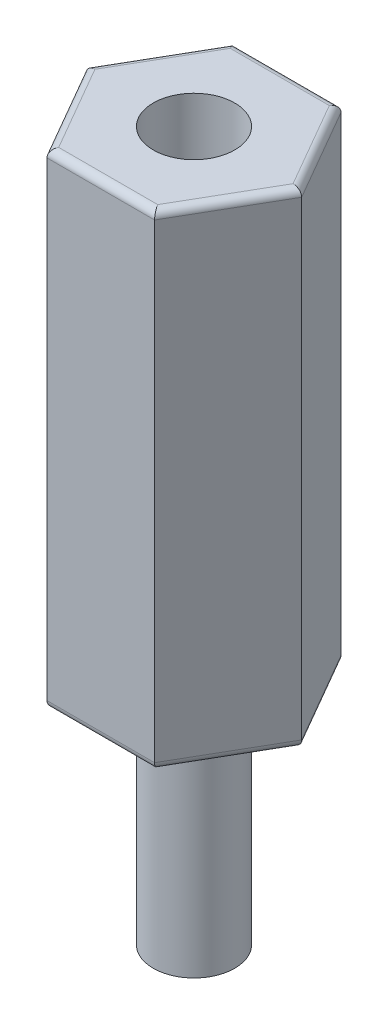
ISO-10303-21;
HEADER;
FILE_DESCRIPTION(('STEP AP214'),'2;1');
FILE_NAME('part.step','',(''),(''),'','','');
FILE_SCHEMA(('AUTOMOTIVE_DESIGN { 1 0 10303 214 1 1 1 1 }'));
ENDSEC;
DATA;
#1=APPLICATION_CONTEXT('core data for automotive mechanical design processes');
#2=APPLICATION_PROTOCOL_DEFINITION('international standard','automotive_design',2000,#1);
#3=PRODUCT_CONTEXT('',#1,'mechanical');
#4=PRODUCT('Part','Part','',(#3));
#5=PRODUCT_RELATED_PRODUCT_CATEGORY('part','',(#4));
#6=PRODUCT_DEFINITION_FORMATION('','',#4);
#7=PRODUCT_DEFINITION_CONTEXT('part definition',#1,'design');
#8=PRODUCT_DEFINITION('design','',#6,#7);
#9=PRODUCT_DEFINITION_SHAPE('','',#8);
#10=(LENGTH_UNIT() NAMED_UNIT(*) SI_UNIT(.MILLI.,.METRE.));
#11=(NAMED_UNIT(*) PLANE_ANGLE_UNIT() SI_UNIT($,.RADIAN.));
#12=(NAMED_UNIT(*) SI_UNIT($,.STERADIAN.) SOLID_ANGLE_UNIT());
#13=UNCERTAINTY_MEASURE_WITH_UNIT(LENGTH_MEASURE(1.E-05),#10,'distance_accuracy_value','');
#14=(GEOMETRIC_REPRESENTATION_CONTEXT(3) GLOBAL_UNCERTAINTY_ASSIGNED_CONTEXT((#13)) GLOBAL_UNIT_ASSIGNED_CONTEXT((#10,
#11,#12)) REPRESENTATION_CONTEXT('',''));
#15=CARTESIAN_POINT('',(0.,0.,0.));
#16=DIRECTION('',(0.,0.,1.));
#17=DIRECTION('',(1.,0.,0.));
#18=AXIS2_PLACEMENT_3D('',#15,#16,#17);
#19=CARTESIAN_POINT('',(2.88675134594813,0.,0.));
#20=DIRECTION('',(0.,1.,0.));
#21=DIRECTION('',(0.,0.,1.));
#22=AXIS2_PLACEMENT_3D('',#19,#20,#21);
#23=PLANE('',#22);
#24=DIRECTION('',(0.5,0.,-0.866025403784439));
#25=VECTOR('',#24,1.);
#26=CARTESIAN_POINT('',(2.71354626519124,0.,-0.100000000000001));
#27=LINE('',#26,#25);
#28=CARTESIAN_POINT('',(2.65581123827228,0.,0.));
#29=VERTEX_POINT('',#28);
#30=CARTESIAN_POINT('',(1.32790561913614,0.,2.3));
#31=VERTEX_POINT('',#30);
#32=EDGE_CURVE('E190',#29,#31,#27,.F.);
#33=ORIENTED_EDGE('',*,*,#32,.T.);
#34=DIRECTION('',(1.,0.,0.));
#35=VECTOR('',#34,1.);
#36=CARTESIAN_POINT('',(2.88675134594813,0.,2.3));
#37=LINE('',#36,#35);
#38=CARTESIAN_POINT('',(-1.32790561913614,0.,2.3));
#39=VERTEX_POINT('',#38);
#40=EDGE_CURVE('E43',#31,#39,#37,.F.);
#41=ORIENTED_EDGE('',*,*,#40,.T.);
#42=DIRECTION('',(0.5,0.,0.866025403784439));
#43=VECTOR('',#42,1.);
#44=CARTESIAN_POINT('',(-1.27017059221718,0.,2.4));
#45=LINE('',#44,#43);
#46=CARTESIAN_POINT('',(-2.65581123827228,0.,0.));
#47=VERTEX_POINT('',#46);
#48=EDGE_CURVE('E57',#39,#47,#45,.F.);
#49=ORIENTED_EDGE('',*,*,#48,.T.);
#50=DIRECTION('',(-0.5,0.,0.866025403784439));
#51=VECTOR('',#50,1.);
#52=CARTESIAN_POINT('',(-1.27017059221718,0.,-2.4));
#53=LINE('',#52,#51);
#54=CARTESIAN_POINT('',(-1.32790561913614,0.,-2.3));
#55=VERTEX_POINT('',#54);
#56=EDGE_CURVE('E196',#47,#55,#53,.F.);
#57=ORIENTED_EDGE('',*,*,#56,.T.);
#58=DIRECTION('',(-1.,0.,0.));
#59=VECTOR('',#58,1.);
#60=CARTESIAN_POINT('',(2.88675134594813,0.,-2.3));
#61=LINE('',#60,#59);
#62=CARTESIAN_POINT('',(1.32790561913614,0.,-2.3));
#63=VERTEX_POINT('',#62);
#64=EDGE_CURVE('E194',#55,#63,#61,.F.);
#65=ORIENTED_EDGE('',*,*,#64,.T.);
#66=DIRECTION('',(-0.5,0.,-0.866025403784439));
#67=VECTOR('',#66,1.);
#68=CARTESIAN_POINT('',(2.71354626519124,0.,0.0999999999999995));
#69=LINE('',#68,#67);
#70=EDGE_CURVE('E192',#63,#29,#69,.F.);
#71=ORIENTED_EDGE('',*,*,#70,.T.);
#72=EDGE_LOOP('',(#33,#41,#49,#57,#65,#71));
#73=FACE_BOUND('',#72,.T.);
#74=CARTESIAN_POINT('',(0.,0.,0.));
#75=DIRECTION('',(0.,1.,0.));
#76=DIRECTION('',(0.,0.,1.));
#77=AXIS2_PLACEMENT_3D('',#74,#75,#76);
#78=CIRCLE('',#77,1.0922);
#79=CARTESIAN_POINT('',(0.,0.,1.0922));
#80=VERTEX_POINT('',#79);
#81=EDGE_CURVE('E11',#80,#80,#78,.F.);
#82=ORIENTED_EDGE('',*,*,#81,.F.);
#83=EDGE_LOOP('',(#82));
#84=FACE_BOUND('',#83,.T.);
#85=ADVANCED_FACE('F35',(#73,#84),#23,.F.);
#86=CARTESIAN_POINT('',(1.44337567297406,13.,2.5));
#87=DIRECTION('',(-0.866025403784439,0.,-0.5));
#88=DIRECTION('',(-0.5,0.,0.866025403784439));
#89=AXIS2_PLACEMENT_3D('',#86,#87,#88);
#90=PLANE('',#89);
#91=DIRECTION('',(0.,-1.,0.));
#92=VECTOR('',#91,1.);
#93=CARTESIAN_POINT('',(2.88675134594813,13.,0.));
#94=LINE('',#93,#92);
#95=CARTESIAN_POINT('',(2.88675134594813,12.8,0.));
#96=VERTEX_POINT('',#95);
#97=CARTESIAN_POINT('',(2.88675134594813,0.200000000000002,0.));
#98=VERTEX_POINT('',#97);
#99=EDGE_CURVE('E151',#96,#98,#94,.T.);
#100=ORIENTED_EDGE('',*,*,#99,.F.);
#101=DIRECTION('',(0.5,0.,-0.866025403784439));
#102=VECTOR('',#101,1.);
#103=CARTESIAN_POINT('',(1.44337567297406,12.8,2.5));
#104=LINE('',#103,#102);
#105=CARTESIAN_POINT('',(1.44337567297406,12.8,2.5));
#106=VERTEX_POINT('',#105);
#107=EDGE_CURVE('E142',#96,#106,#104,.F.);
#108=ORIENTED_EDGE('',*,*,#107,.T.);
#109=DIRECTION('',(0.,-1.,0.));
#110=VECTOR('',#109,1.);
#111=CARTESIAN_POINT('',(1.44337567297406,13.,2.5));
#112=LINE('',#111,#110);
#113=CARTESIAN_POINT('',(1.44337567297406,0.200000000000004,2.5));
#114=VERTEX_POINT('',#113);
#115=EDGE_CURVE('E210',#106,#114,#112,.T.);
#116=ORIENTED_EDGE('',*,*,#115,.T.);
#117=DIRECTION('',(0.5,0.,-0.866025403784439));
#118=VECTOR('',#117,1.);
#119=CARTESIAN_POINT('',(1.44337567297406,0.200000000000001,2.5));
#120=LINE('',#119,#118);
#121=EDGE_CURVE('E183',#114,#98,#120,.T.);
#122=ORIENTED_EDGE('',*,*,#121,.T.);
#123=EDGE_LOOP('',(#100,#108,#116,#122));
#124=FACE_BOUND('',#123,.T.);
#125=ADVANCED_FACE('F255',(#124),#90,.F.);
#126=CARTESIAN_POINT('',(2.88675134594813,13.,0.));
#127=DIRECTION('',(-0.866025403784438,0.,0.5));
#128=DIRECTION('',(0.5,0.,0.866025403784439));
#129=AXIS2_PLACEMENT_3D('',#126,#127,#128);
#130=PLANE('',#129);
#131=DIRECTION('',(0.,-1.,0.));
#132=VECTOR('',#131,1.);
#133=CARTESIAN_POINT('',(1.44337567297406,13.,-2.5));
#134=LINE('',#133,#132);
#135=CARTESIAN_POINT('',(1.44337567297406,12.8,-2.5));
#136=VERTEX_POINT('',#135);
#137=CARTESIAN_POINT('',(1.44337567297406,0.200000000000002,-2.5));
#138=VERTEX_POINT('',#137);
#139=EDGE_CURVE('E154',#136,#138,#134,.T.);
#140=ORIENTED_EDGE('',*,*,#139,.F.);
#141=DIRECTION('',(-0.5,0.,-0.866025403784439));
#142=VECTOR('',#141,1.);
#143=CARTESIAN_POINT('',(2.88675134594813,12.8,0.));
#144=LINE('',#143,#142);
#145=EDGE_CURVE('E188',#136,#96,#144,.F.);
#146=ORIENTED_EDGE('',*,*,#145,.T.);
#147=ORIENTED_EDGE('',*,*,#99,.T.);
#148=DIRECTION('',(-0.5,0.,-0.866025403784439));
#149=VECTOR('',#148,1.);
#150=CARTESIAN_POINT('',(2.88675134594813,0.200000000000001,0.));
#151=LINE('',#150,#149);
#152=EDGE_CURVE('E186',#98,#138,#151,.T.);
#153=ORIENTED_EDGE('',*,*,#152,.T.);
#154=EDGE_LOOP('',(#140,#146,#147,#153));
#155=FACE_BOUND('',#154,.T.);
#156=ADVANCED_FACE('F273',(#155),#130,.F.);
#157=CARTESIAN_POINT('',(1.44337567297406,13.,-2.5));
#158=DIRECTION('',(0.,0.,1.));
#159=DIRECTION('',(1.,0.,0.));
#160=AXIS2_PLACEMENT_3D('',#157,#158,#159);
#161=PLANE('',#160);
#162=DIRECTION('',(0.,-1.,0.));
#163=VECTOR('',#162,1.);
#164=CARTESIAN_POINT('',(-1.44337567297406,13.,-2.5));
#165=LINE('',#164,#163);
#166=CARTESIAN_POINT('',(-1.44337567297406,12.8,-2.5));
#167=VERTEX_POINT('',#166);
#168=CARTESIAN_POINT('',(-1.44337567297406,0.200000000000002,-2.5));
#169=VERTEX_POINT('',#168);
#170=EDGE_CURVE('E264',#167,#169,#165,.T.);
#171=ORIENTED_EDGE('',*,*,#170,.F.);
#172=DIRECTION('',(-1.,0.,0.));
#173=VECTOR('',#172,1.);
#174=CARTESIAN_POINT('',(1.44337567297406,12.8,-2.5));
#175=LINE('',#174,#173);
#176=EDGE_CURVE('E167',#167,#136,#175,.F.);
#177=ORIENTED_EDGE('',*,*,#176,.T.);
#178=ORIENTED_EDGE('',*,*,#139,.T.);
#179=DIRECTION('',(-1.,0.,0.));
#180=VECTOR('',#179,1.);
#181=CARTESIAN_POINT('',(1.44337567297406,0.200000000000001,-2.5));
#182=LINE('',#181,#180);
#183=EDGE_CURVE('E165',#138,#169,#182,.T.);
#184=ORIENTED_EDGE('',*,*,#183,.T.);
#185=EDGE_LOOP('',(#171,#177,#178,#184));
#186=FACE_BOUND('',#185,.T.);
#187=ADVANCED_FACE('F270',(#186),#161,.F.);
#188=CARTESIAN_POINT('',(-1.44337567297406,13.,-2.5));
#189=DIRECTION('',(0.866025403784439,0.,0.5));
#190=DIRECTION('',(0.5,0.,-0.866025403784439));
#191=AXIS2_PLACEMENT_3D('',#188,#189,#190);
#192=PLANE('',#191);
#193=DIRECTION('',(0.,-1.,0.));
#194=VECTOR('',#193,1.);
#195=CARTESIAN_POINT('',(-2.88675134594813,13.,0.));
#196=LINE('',#195,#194);
#197=CARTESIAN_POINT('',(-2.88675134594813,12.8,0.));
#198=VERTEX_POINT('',#197);
#199=CARTESIAN_POINT('',(-2.88675134594813,0.200000000000002,0.));
#200=VERTEX_POINT('',#199);
#201=EDGE_CURVE('E257',#198,#200,#196,.T.);
#202=ORIENTED_EDGE('',*,*,#201,.F.);
#203=DIRECTION('',(-0.5,0.,0.866025403784439));
#204=VECTOR('',#203,1.);
#205=CARTESIAN_POINT('',(-1.44337567297406,12.8,-2.5));
#206=LINE('',#205,#204);
#207=EDGE_CURVE('E172',#198,#167,#206,.F.);
#208=ORIENTED_EDGE('',*,*,#207,.T.);
#209=ORIENTED_EDGE('',*,*,#170,.T.);
#210=DIRECTION('',(-0.5,0.,0.866025403784439));
#211=VECTOR('',#210,1.);
#212=CARTESIAN_POINT('',(-1.44337567297406,0.200000000000001,-2.5));
#213=LINE('',#212,#211);
#214=EDGE_CURVE('E170',#169,#200,#213,.T.);
#215=ORIENTED_EDGE('',*,*,#214,.T.);
#216=EDGE_LOOP('',(#202,#208,#209,#215));
#217=FACE_BOUND('',#216,.T.);
#218=ADVANCED_FACE('F280',(#217),#192,.F.);
#219=CARTESIAN_POINT('',(-2.88675134594813,13.,0.));
#220=DIRECTION('',(0.866025403784439,0.,-0.5));
#221=DIRECTION('',(-0.5,0.,-0.866025403784439));
#222=AXIS2_PLACEMENT_3D('',#219,#220,#221);
#223=PLANE('',#222);
#224=DIRECTION('',(0.,-1.,0.));
#225=VECTOR('',#224,1.);
#226=CARTESIAN_POINT('',(-1.44337567297406,13.,2.5));
#227=LINE('',#226,#225);
#228=CARTESIAN_POINT('',(-1.44337567297406,12.8,2.5));
#229=VERTEX_POINT('',#228);
#230=CARTESIAN_POINT('',(-1.44337567297406,0.200000000000002,2.5));
#231=VERTEX_POINT('',#230);
#232=EDGE_CURVE('E252',#229,#231,#227,.T.);
#233=ORIENTED_EDGE('',*,*,#232,.F.);
#234=DIRECTION('',(0.5,0.,0.866025403784439));
#235=VECTOR('',#234,1.);
#236=CARTESIAN_POINT('',(-2.88675134594813,12.8,0.));
#237=LINE('',#236,#235);
#238=EDGE_CURVE('E176',#229,#198,#237,.F.);
#239=ORIENTED_EDGE('',*,*,#238,.T.);
#240=ORIENTED_EDGE('',*,*,#201,.T.);
#241=DIRECTION('',(0.5,0.,0.866025403784439));
#242=VECTOR('',#241,1.);
#243=CARTESIAN_POINT('',(-2.88675134594813,0.200000000000001,0.));
#244=LINE('',#243,#242);
#245=EDGE_CURVE('E174',#200,#231,#244,.T.);
#246=ORIENTED_EDGE('',*,*,#245,.T.);
#247=EDGE_LOOP('',(#233,#239,#240,#246));
#248=FACE_BOUND('',#247,.T.);
#249=ADVANCED_FACE('F292',(#248),#223,.F.);
#250=CARTESIAN_POINT('',(-1.44337567297406,13.,2.5));
#251=DIRECTION('',(0.,0.,-1.));
#252=DIRECTION('',(-1.,0.,0.));
#253=AXIS2_PLACEMENT_3D('',#250,#251,#252);
#254=PLANE('',#253);
#255=ORIENTED_EDGE('',*,*,#115,.F.);
#256=DIRECTION('',(1.,0.,0.));
#257=VECTOR('',#256,1.);
#258=CARTESIAN_POINT('',(-1.44337567297406,12.8,2.5));
#259=LINE('',#258,#257);
#260=EDGE_CURVE('E181',#106,#229,#259,.F.);
#261=ORIENTED_EDGE('',*,*,#260,.T.);
#262=ORIENTED_EDGE('',*,*,#232,.T.);
#263=DIRECTION('',(1.,0.,0.));
#264=VECTOR('',#263,1.);
#265=CARTESIAN_POINT('',(-1.44337567297406,0.200000000000001,2.5));
#266=LINE('',#265,#264);
#267=EDGE_CURVE('E178',#231,#114,#266,.T.);
#268=ORIENTED_EDGE('',*,*,#267,.T.);
#269=EDGE_LOOP('',(#255,#261,#262,#268));
#270=FACE_BOUND('',#269,.T.);
#271=ADVANCED_FACE('F249',(#270),#254,.F.);
#272=CARTESIAN_POINT('',(2.88675134594813,13.,0.));
#273=DIRECTION('',(0.,1.,0.));
#274=DIRECTION('',(0.,0.,1.));
#275=AXIS2_PLACEMENT_3D('',#272,#273,#274);
#276=PLANE('',#275);
#277=CARTESIAN_POINT('',(0.,13.,0.));
#278=DIRECTION('',(0.,1.,0.));
#279=DIRECTION('',(0.,0.,1.));
#280=AXIS2_PLACEMENT_3D('',#277,#278,#279);
#281=CIRCLE('',#280,1.0922);
#282=CARTESIAN_POINT('',(0.,13.,1.0922));
#283=VERTEX_POINT('',#282);
#284=EDGE_CURVE('E375',#283,#283,#281,.T.);
#285=ORIENTED_EDGE('',*,*,#284,.F.);
#286=EDGE_LOOP('',(#285));
#287=FACE_BOUND('',#286,.T.);
#288=DIRECTION('',(-0.5,0.,-0.866025403784439));
#289=VECTOR('',#288,1.);
#290=CARTESIAN_POINT('',(1.27017059221718,13.,-2.4));
#291=LINE('',#290,#289);
#292=CARTESIAN_POINT('',(2.65581123827228,13.,0.));
#293=VERTEX_POINT('',#292);
#294=CARTESIAN_POINT('',(1.32790561913614,13.,-2.3));
#295=VERTEX_POINT('',#294);
#296=EDGE_CURVE('E130',#293,#295,#291,.T.);
#297=ORIENTED_EDGE('',*,*,#296,.T.);
#298=DIRECTION('',(-1.,0.,0.));
#299=VECTOR('',#298,1.);
#300=CARTESIAN_POINT('',(-1.44337567297406,13.,-2.3));
#301=LINE('',#300,#299);
#302=CARTESIAN_POINT('',(-1.32790561913614,13.,-2.3));
#303=VERTEX_POINT('',#302);
#304=EDGE_CURVE('E163',#295,#303,#301,.T.);
#305=ORIENTED_EDGE('',*,*,#304,.T.);
#306=DIRECTION('',(-0.5,0.,0.866025403784439));
#307=VECTOR('',#306,1.);
#308=CARTESIAN_POINT('',(-2.71354626519124,13.,0.100000000000001));
#309=LINE('',#308,#307);
#310=CARTESIAN_POINT('',(-2.65581123827228,13.,0.));
#311=VERTEX_POINT('',#310);
#312=EDGE_CURVE('E161',#303,#311,#309,.T.);
#313=ORIENTED_EDGE('',*,*,#312,.T.);
#314=DIRECTION('',(0.5,0.,0.866025403784439));
#315=VECTOR('',#314,1.);
#316=CARTESIAN_POINT('',(-1.27017059221718,13.,2.4));
#317=LINE('',#316,#315);
#318=CARTESIAN_POINT('',(-1.32790561913614,13.,2.3));
#319=VERTEX_POINT('',#318);
#320=EDGE_CURVE('E159',#311,#319,#317,.T.);
#321=ORIENTED_EDGE('',*,*,#320,.T.);
#322=DIRECTION('',(1.,0.,0.));
#323=VECTOR('',#322,1.);
#324=CARTESIAN_POINT('',(1.44337567297406,13.,2.3));
#325=LINE('',#324,#323);
#326=CARTESIAN_POINT('',(1.32790561913614,13.,2.3));
#327=VERTEX_POINT('',#326);
#328=EDGE_CURVE('E133',#319,#327,#325,.T.);
#329=ORIENTED_EDGE('',*,*,#328,.T.);
#330=DIRECTION('',(0.5,0.,-0.866025403784439));
#331=VECTOR('',#330,1.);
#332=CARTESIAN_POINT('',(2.71354626519124,13.,-0.100000000000001));
#333=LINE('',#332,#331);
#334=EDGE_CURVE('E125',#327,#293,#333,.T.);
#335=ORIENTED_EDGE('',*,*,#334,.T.);
#336=EDGE_LOOP('',(#297,#305,#313,#321,#329,#335));
#337=FACE_BOUND('',#336,.T.);
#338=ADVANCED_FACE('F127',(#287,#337),#276,.T.);
#339=CARTESIAN_POINT('',(2.88675134594813,12.8,2.3));
#340=DIRECTION('',(-1.,0.,0.));
#341=DIRECTION('',(0.,0.,1.));
#342=AXIS2_PLACEMENT_3D('',#339,#340,#341);
#343=CYLINDRICAL_SURFACE('',#342,0.2);
#344=CARTESIAN_POINT('',(-1.32790561913614,12.8,2.3));
#345=DIRECTION('',(-0.866025403784439,0.,-0.5));
#346=DIRECTION('',(-0.5,0.,0.866025403784439));
#347=AXIS2_PLACEMENT_3D('',#344,#345,#346);
#348=ELLIPSE('',#347,0.23094010767585,0.2);
#349=EDGE_CURVE('E145',#229,#319,#348,.T.);
#350=ORIENTED_EDGE('',*,*,#349,.F.);
#351=ORIENTED_EDGE('',*,*,#260,.F.);
#352=CARTESIAN_POINT('',(1.32790561913614,12.8,2.3));
#353=DIRECTION('',(-0.866025403784438,0.,0.5));
#354=DIRECTION('',(0.5,0.,0.866025403784439));
#355=AXIS2_PLACEMENT_3D('',#352,#353,#354);
#356=ELLIPSE('',#355,0.23094010767585,0.2);
#357=EDGE_CURVE('E208',#327,#106,#356,.F.);
#358=ORIENTED_EDGE('',*,*,#357,.F.);
#359=ORIENTED_EDGE('',*,*,#328,.F.);
#360=EDGE_LOOP('',(#350,#351,#358,#359));
#361=FACE_BOUND('',#360,.T.);
#362=ADVANCED_FACE('F315',(#361),#343,.T.);
#363=CARTESIAN_POINT('',(2.71354626519124,12.8,-0.100000000000001));
#364=DIRECTION('',(-0.5,0.,0.866025403784439));
#365=DIRECTION('',(0.866025403784439,0.,0.5));
#366=AXIS2_PLACEMENT_3D('',#363,#364,#365);
#367=CYLINDRICAL_SURFACE('',#366,0.2);
#368=ORIENTED_EDGE('',*,*,#357,.T.);
#369=ORIENTED_EDGE('',*,*,#107,.F.);
#370=CARTESIAN_POINT('',(2.65581123827228,12.8,0.));
#371=DIRECTION('',(0.,0.,1.));
#372=DIRECTION('',(1.,0.,0.));
#373=AXIS2_PLACEMENT_3D('',#370,#371,#372);
#374=ELLIPSE('',#373,0.23094010767585,0.2);
#375=EDGE_CURVE('E140',#293,#96,#374,.F.);
#376=ORIENTED_EDGE('',*,*,#375,.F.);
#377=ORIENTED_EDGE('',*,*,#334,.F.);
#378=EDGE_LOOP('',(#368,#369,#376,#377));
#379=FACE_BOUND('',#378,.T.);
#380=ADVANCED_FACE('F141',(#379),#367,.T.);
#381=CARTESIAN_POINT('',(-1.27017059221718,12.8,2.4));
#382=DIRECTION('',(-0.5,0.,-0.866025403784439));
#383=DIRECTION('',(-0.866025403784439,0.,0.5));
#384=AXIS2_PLACEMENT_3D('',#381,#382,#383);
#385=CYLINDRICAL_SURFACE('',#384,0.2);
#386=ORIENTED_EDGE('',*,*,#349,.T.);
#387=ORIENTED_EDGE('',*,*,#320,.F.);
#388=CARTESIAN_POINT('',(-2.65581123827228,12.8,0.));
#389=DIRECTION('',(0.,0.,-1.));
#390=DIRECTION('',(-1.,0.,0.));
#391=AXIS2_PLACEMENT_3D('',#388,#389,#390);
#392=ELLIPSE('',#391,0.23094010767585,0.2);
#393=EDGE_CURVE('E146',#198,#311,#392,.T.);
#394=ORIENTED_EDGE('',*,*,#393,.F.);
#395=ORIENTED_EDGE('',*,*,#238,.F.);
#396=EDGE_LOOP('',(#386,#387,#394,#395));
#397=FACE_BOUND('',#396,.T.);
#398=ADVANCED_FACE('F306',(#397),#385,.T.);
#399=CARTESIAN_POINT('',(2.71354626519124,12.8,0.0999999999999994));
#400=DIRECTION('',(0.5,0.,0.866025403784439));
#401=DIRECTION('',(0.866025403784438,0.,-0.5));
#402=AXIS2_PLACEMENT_3D('',#399,#400,#401);
#403=CYLINDRICAL_SURFACE('',#402,0.2);
#404=ORIENTED_EDGE('',*,*,#375,.T.);
#405=ORIENTED_EDGE('',*,*,#145,.F.);
#406=CARTESIAN_POINT('',(1.32790561913614,12.8,-2.3));
#407=DIRECTION('',(0.866025403784439,0.,0.5));
#408=DIRECTION('',(-0.5,0.,0.866025403784439));
#409=AXIS2_PLACEMENT_3D('',#406,#407,#408);
#410=ELLIPSE('',#409,0.23094010767585,0.2);
#411=EDGE_CURVE('E149',#295,#136,#410,.F.);
#412=ORIENTED_EDGE('',*,*,#411,.F.);
#413=ORIENTED_EDGE('',*,*,#296,.F.);
#414=EDGE_LOOP('',(#404,#405,#412,#413));
#415=FACE_BOUND('',#414,.T.);
#416=ADVANCED_FACE('F148',(#415),#403,.T.);
#417=CARTESIAN_POINT('',(-1.27017059221718,12.8,-2.4));
#418=DIRECTION('',(0.5,0.,-0.866025403784439));
#419=DIRECTION('',(-0.866025403784439,0.,-0.5));
#420=AXIS2_PLACEMENT_3D('',#417,#418,#419);
#421=CYLINDRICAL_SURFACE('',#420,0.2);
#422=ORIENTED_EDGE('',*,*,#393,.T.);
#423=ORIENTED_EDGE('',*,*,#312,.F.);
#424=CARTESIAN_POINT('',(-1.32790561913614,12.8,-2.3));
#425=DIRECTION('',(0.866025403784439,0.,-0.5));
#426=DIRECTION('',(-0.5,0.,-0.866025403784439));
#427=AXIS2_PLACEMENT_3D('',#424,#425,#426);
#428=ELLIPSE('',#427,0.23094010767585,0.2);
#429=EDGE_CURVE('E200',#167,#303,#428,.T.);
#430=ORIENTED_EDGE('',*,*,#429,.F.);
#431=ORIENTED_EDGE('',*,*,#207,.F.);
#432=EDGE_LOOP('',(#422,#423,#430,#431));
#433=FACE_BOUND('',#432,.T.);
#434=ADVANCED_FACE('F310',(#433),#421,.T.);
#435=CARTESIAN_POINT('',(2.88675134594813,12.8,-2.3));
#436=DIRECTION('',(1.,0.,0.));
#437=DIRECTION('',(0.,0.,-1.));
#438=AXIS2_PLACEMENT_3D('',#435,#436,#437);
#439=CYLINDRICAL_SURFACE('',#438,0.2);
#440=ORIENTED_EDGE('',*,*,#411,.T.);
#441=ORIENTED_EDGE('',*,*,#176,.F.);
#442=ORIENTED_EDGE('',*,*,#429,.T.);
#443=ORIENTED_EDGE('',*,*,#304,.F.);
#444=EDGE_LOOP('',(#440,#441,#442,#443));
#445=FACE_BOUND('',#444,.T.);
#446=ADVANCED_FACE('F312',(#445),#439,.T.);
#447=CARTESIAN_POINT('',(1.44337567297406,0.200000000000001,-2.3));
#448=DIRECTION('',(-1.,0.,0.));
#449=DIRECTION('',(0.,0.,1.));
#450=AXIS2_PLACEMENT_3D('',#447,#448,#449);
#451=CYLINDRICAL_SURFACE('',#450,0.2);
#452=CARTESIAN_POINT('',(1.32790561913614,0.200000000000001,-2.3));
#453=DIRECTION('',(-0.866025403784439,0.,-0.5));
#454=DIRECTION('',(0.5,0.,-0.866025403784439));
#455=AXIS2_PLACEMENT_3D('',#452,#453,#454);
#456=ELLIPSE('',#455,0.23094010767585,0.2);
#457=EDGE_CURVE('E221',#63,#138,#456,.F.);
#458=ORIENTED_EDGE('',*,*,#457,.F.);
#459=ORIENTED_EDGE('',*,*,#64,.F.);
#460=CARTESIAN_POINT('',(-1.32790561913614,0.200000000000001,-2.3));
#461=DIRECTION('',(-0.866025403784439,0.,0.5));
#462=DIRECTION('',(-0.5,0.,-0.866025403784439));
#463=AXIS2_PLACEMENT_3D('',#460,#461,#462);
#464=ELLIPSE('',#463,0.23094010767585,0.2);
#465=EDGE_CURVE('E202',#169,#55,#464,.T.);
#466=ORIENTED_EDGE('',*,*,#465,.F.);
#467=ORIENTED_EDGE('',*,*,#183,.F.);
#468=EDGE_LOOP('',(#458,#459,#466,#467));
#469=FACE_BOUND('',#468,.T.);
#470=ADVANCED_FACE('F37',(#469),#451,.T.);
#471=CARTESIAN_POINT('',(-1.27017059221718,0.200000000000001,-2.4));
#472=DIRECTION('',(-0.5,0.,0.866025403784439));
#473=DIRECTION('',(0.866025403784439,0.,0.5));
#474=AXIS2_PLACEMENT_3D('',#471,#472,#473);
#475=CYLINDRICAL_SURFACE('',#474,0.2);
#476=ORIENTED_EDGE('',*,*,#465,.T.);
#477=ORIENTED_EDGE('',*,*,#56,.F.);
#478=CARTESIAN_POINT('',(-2.65581123827228,0.200000000000001,0.));
#479=DIRECTION('',(0.,0.,1.));
#480=DIRECTION('',(-1.,0.,0.));
#481=AXIS2_PLACEMENT_3D('',#478,#479,#480);
#482=ELLIPSE('',#481,0.23094010767585,0.2);
#483=EDGE_CURVE('E218',#200,#47,#482,.T.);
#484=ORIENTED_EDGE('',*,*,#483,.F.);
#485=ORIENTED_EDGE('',*,*,#214,.F.);
#486=EDGE_LOOP('',(#476,#477,#484,#485));
#487=FACE_BOUND('',#486,.T.);
#488=ADVANCED_FACE('F227',(#487),#475,.T.);
#489=CARTESIAN_POINT('',(2.71354626519124,0.200000000000001,0.0999999999999992));
#490=DIRECTION('',(-0.5,0.,-0.866025403784439));
#491=DIRECTION('',(-0.866025403784438,0.,0.5));
#492=AXIS2_PLACEMENT_3D('',#489,#490,#491);
#493=CYLINDRICAL_SURFACE('',#492,0.2);
#494=ORIENTED_EDGE('',*,*,#457,.T.);
#495=ORIENTED_EDGE('',*,*,#152,.F.);
#496=CARTESIAN_POINT('',(2.65581123827228,0.200000000000001,0.));
#497=DIRECTION('',(0.,0.,-1.));
#498=DIRECTION('',(1.,0.,0.));
#499=AXIS2_PLACEMENT_3D('',#496,#497,#498);
#500=ELLIPSE('',#499,0.23094010767585,0.2);
#501=EDGE_CURVE('E215',#29,#98,#500,.F.);
#502=ORIENTED_EDGE('',*,*,#501,.F.);
#503=ORIENTED_EDGE('',*,*,#70,.F.);
#504=EDGE_LOOP('',(#494,#495,#502,#503));
#505=FACE_BOUND('',#504,.T.);
#506=ADVANCED_FACE('F239',(#505),#493,.T.);
#507=CARTESIAN_POINT('',(-2.71354626519124,0.200000000000001,-0.0999999999999996));
#508=DIRECTION('',(0.5,0.,0.866025403784439));
#509=DIRECTION('',(0.866025403784439,0.,-0.5));
#510=AXIS2_PLACEMENT_3D('',#507,#508,#509);
#511=CYLINDRICAL_SURFACE('',#510,0.2);
#512=ORIENTED_EDGE('',*,*,#483,.T.);
#513=ORIENTED_EDGE('',*,*,#48,.F.);
#514=CARTESIAN_POINT('',(-1.32790561913614,0.200000000000001,2.3));
#515=DIRECTION('',(0.866025403784439,0.,0.5));
#516=DIRECTION('',(-0.5,0.,0.866025403784439));
#517=AXIS2_PLACEMENT_3D('',#514,#515,#516);
#518=ELLIPSE('',#517,0.23094010767585,0.2);
#519=EDGE_CURVE('E50',#231,#39,#518,.T.);
#520=ORIENTED_EDGE('',*,*,#519,.F.);
#521=ORIENTED_EDGE('',*,*,#245,.F.);
#522=EDGE_LOOP('',(#512,#513,#520,#521));
#523=FACE_BOUND('',#522,.T.);
#524=ADVANCED_FACE('F318',(#523),#511,.T.);
#525=CARTESIAN_POINT('',(1.27017059221718,0.200000000000001,2.4));
#526=DIRECTION('',(0.5,0.,-0.866025403784439));
#527=DIRECTION('',(-0.866025403784439,0.,-0.5));
#528=AXIS2_PLACEMENT_3D('',#525,#526,#527);
#529=CYLINDRICAL_SURFACE('',#528,0.2);
#530=ORIENTED_EDGE('',*,*,#501,.T.);
#531=ORIENTED_EDGE('',*,*,#121,.F.);
#532=CARTESIAN_POINT('',(1.32790561913614,0.200000000000001,2.3));
#533=DIRECTION('',(0.866025403784438,0.,-0.5));
#534=DIRECTION('',(-0.5,0.,-0.866025403784439));
#535=AXIS2_PLACEMENT_3D('',#532,#533,#534);
#536=ELLIPSE('',#535,0.23094010767585,0.2);
#537=EDGE_CURVE('E211',#31,#114,#536,.F.);
#538=ORIENTED_EDGE('',*,*,#537,.F.);
#539=ORIENTED_EDGE('',*,*,#32,.F.);
#540=EDGE_LOOP('',(#530,#531,#538,#539));
#541=FACE_BOUND('',#540,.T.);
#542=ADVANCED_FACE('F243',(#541),#529,.T.);
#543=CARTESIAN_POINT('',(-1.44337567297406,0.200000000000001,2.3));
#544=DIRECTION('',(1.,0.,0.));
#545=DIRECTION('',(0.,0.,-1.));
#546=AXIS2_PLACEMENT_3D('',#543,#544,#545);
#547=CYLINDRICAL_SURFACE('',#546,0.2);
#548=ORIENTED_EDGE('',*,*,#519,.T.);
#549=ORIENTED_EDGE('',*,*,#40,.F.);
#550=ORIENTED_EDGE('',*,*,#537,.T.);
#551=ORIENTED_EDGE('',*,*,#267,.F.);
#552=EDGE_LOOP('',(#548,#549,#550,#551));
#553=FACE_BOUND('',#552,.T.);
#554=ADVANCED_FACE('F244',(#553),#547,.T.);
#555=CARTESIAN_POINT('',(0.,-6.,0.));
#556=DIRECTION('',(0.,1.,0.));
#557=DIRECTION('',(0.,0.,1.));
#558=AXIS2_PLACEMENT_3D('',#555,#556,#557);
#559=CYLINDRICAL_SURFACE('',#558,1.0922);
#560=CARTESIAN_POINT('',(0.,-6.,0.));
#561=DIRECTION('',(0.,-1.,0.));
#562=DIRECTION('',(0.,0.,-1.));
#563=AXIS2_PLACEMENT_3D('',#560,#561,#562);
#564=CIRCLE('',#563,1.0922);
#565=CARTESIAN_POINT('',(0.,-6.,-1.0922));
#566=VERTEX_POINT('',#565);
#567=EDGE_CURVE('E213',#566,#566,#564,.T.);
#568=ORIENTED_EDGE('',*,*,#567,.F.);
#569=EDGE_LOOP('',(#568));
#570=FACE_BOUND('',#569,.T.);
#571=ORIENTED_EDGE('',*,*,#81,.T.);
#572=EDGE_LOOP('',(#571));
#573=FACE_BOUND('',#572,.T.);
#574=ADVANCED_FACE('F349',(#570,#573),#559,.T.);
#575=CARTESIAN_POINT('',(0.,-6.,0.));
#576=DIRECTION('',(0.,-1.,0.));
#577=DIRECTION('',(0.,0.,-1.));
#578=AXIS2_PLACEMENT_3D('',#575,#576,#577);
#579=PLANE('',#578);
#580=ORIENTED_EDGE('',*,*,#567,.T.);
#581=EDGE_LOOP('',(#580));
#582=FACE_BOUND('',#581,.T.);
#583=ADVANCED_FACE('F353',(#582),#579,.T.);
#584=CARTESIAN_POINT('',(0.,8.24,0.));
#585=DIRECTION('',(0.,1.,0.));
#586=DIRECTION('',(0.,0.,1.));
#587=AXIS2_PLACEMENT_3D('',#584,#585,#586);
#588=CYLINDRICAL_SURFACE('',#587,1.0922);
#589=CARTESIAN_POINT('',(0.,8.24,0.));
#590=DIRECTION('',(0.,1.,0.));
#591=DIRECTION('',(0.,0.,1.));
#592=AXIS2_PLACEMENT_3D('',#589,#590,#591);
#593=CIRCLE('',#592,1.0922);
#594=CARTESIAN_POINT('',(0.,8.24,1.0922));
#595=VERTEX_POINT('',#594);
#596=EDGE_CURVE('E374',#595,#595,#593,.T.);
#597=ORIENTED_EDGE('',*,*,#596,.F.);
#598=EDGE_LOOP('',(#597));
#599=FACE_BOUND('',#598,.T.);
#600=ORIENTED_EDGE('',*,*,#284,.T.);
#601=EDGE_LOOP('',(#600));
#602=FACE_BOUND('',#601,.T.);
#603=ADVANCED_FACE('F358',(#599,#602),#588,.F.);
#604=CARTESIAN_POINT('',(0.,8.24,0.));
#605=DIRECTION('',(0.,1.,0.));
#606=DIRECTION('',(0.,0.,1.));
#607=AXIS2_PLACEMENT_3D('',#604,#605,#606);
#608=PLANE('',#607);
#609=ORIENTED_EDGE('',*,*,#596,.T.);
#610=EDGE_LOOP('',(#609));
#611=FACE_BOUND('',#610,.T.);
#612=ADVANCED_FACE('F366',(#611),#608,.T.);
#613=CLOSED_SHELL('',(#85,#125,#156,#187,#218,#249,#271,#338,#362,#380,#398,#416,#434,#446,#470,
#488,#506,#524,#542,#554,#574,#583,#603,#612));
#614=MANIFOLD_SOLID_BREP('B2',#613);
#615=ADVANCED_BREP_SHAPE_REPRESENTATION('',(#18,#614),#14);
#616=SHAPE_DEFINITION_REPRESENTATION(#9,#615);
ENDSEC;
END-ISO-10303-21;
